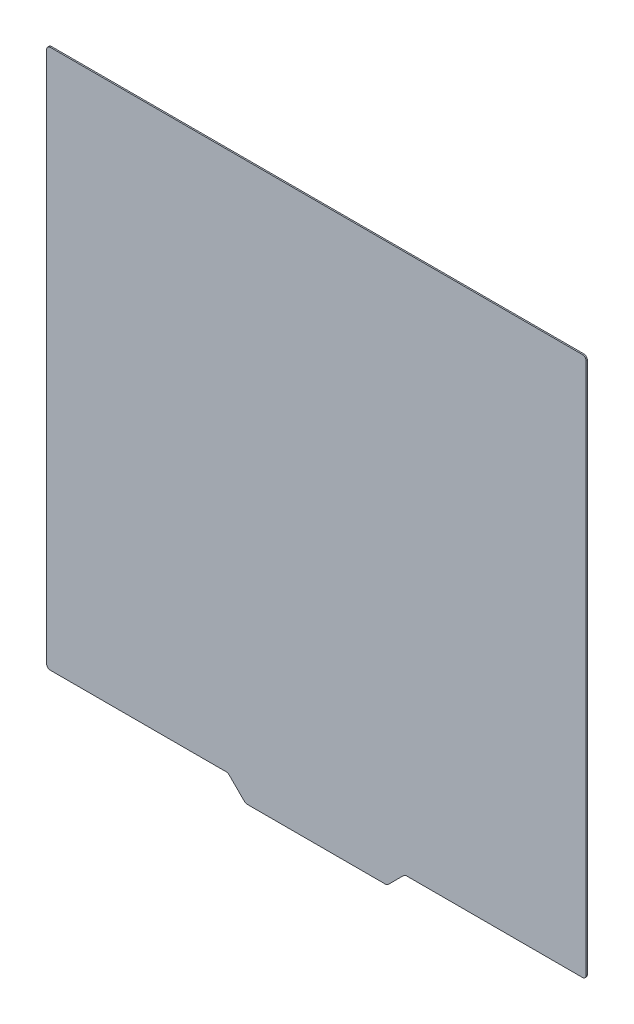
ISO-10303-21;
HEADER;
FILE_DESCRIPTION(('STEP AP214'),'2;1');
FILE_NAME('part.step','',(''),(''),'','','');
FILE_SCHEMA(('AUTOMOTIVE_DESIGN { 1 0 10303 214 1 1 1 1 }'));
ENDSEC;
DATA;
#1=APPLICATION_CONTEXT('core data for automotive mechanical design processes');
#2=APPLICATION_PROTOCOL_DEFINITION('international standard','automotive_design',2000,#1);
#3=PRODUCT_CONTEXT('',#1,'mechanical');
#4=PRODUCT('Part','Part','',(#3));
#5=PRODUCT_RELATED_PRODUCT_CATEGORY('part','',(#4));
#6=PRODUCT_DEFINITION_FORMATION('','',#4);
#7=PRODUCT_DEFINITION_CONTEXT('part definition',#1,'design');
#8=PRODUCT_DEFINITION('design','',#6,#7);
#9=PRODUCT_DEFINITION_SHAPE('','',#8);
#10=(LENGTH_UNIT() NAMED_UNIT(*) SI_UNIT(.MILLI.,.METRE.));
#11=(NAMED_UNIT(*) PLANE_ANGLE_UNIT() SI_UNIT($,.RADIAN.));
#12=(NAMED_UNIT(*) SI_UNIT($,.STERADIAN.) SOLID_ANGLE_UNIT());
#13=UNCERTAINTY_MEASURE_WITH_UNIT(LENGTH_MEASURE(1.E-05),#10,'distance_accuracy_value','');
#14=(GEOMETRIC_REPRESENTATION_CONTEXT(3) GLOBAL_UNCERTAINTY_ASSIGNED_CONTEXT((#13)) GLOBAL_UNIT_ASSIGNED_CONTEXT((#10,
#11,#12)) REPRESENTATION_CONTEXT('',''));
#15=CARTESIAN_POINT('',(0.,0.,0.));
#16=DIRECTION('',(0.,0.,1.));
#17=DIRECTION('',(1.,0.,0.));
#18=AXIS2_PLACEMENT_3D('',#15,#16,#17);
#19=CARTESIAN_POINT('',(152.5,-152.5,0.75));
#20=DIRECTION('',(-1.,0.,0.));
#21=DIRECTION('',(0.,0.,1.));
#22=AXIS2_PLACEMENT_3D('',#19,#20,#21);
#23=PLANE('',#22);
#24=DIRECTION('',(0.,1.,0.));
#25=VECTOR('',#24,1.);
#26=CARTESIAN_POINT('',(152.5,-152.5,0.75));
#27=LINE('',#26,#25);
#28=CARTESIAN_POINT('',(152.5,-150.5,0.75));
#29=VERTEX_POINT('',#28);
#30=CARTESIAN_POINT('',(152.5,150.5,0.75));
#31=VERTEX_POINT('',#30);
#32=EDGE_CURVE('E193',#29,#31,#27,.T.);
#33=ORIENTED_EDGE('',*,*,#32,.F.);
#34=DIRECTION('',(0.,0.,-1.));
#35=VECTOR('',#34,1.);
#36=CARTESIAN_POINT('',(152.5,-150.5,0.75));
#37=LINE('',#36,#35);
#38=CARTESIAN_POINT('',(152.5,-150.5,0.));
#39=VERTEX_POINT('',#38);
#40=EDGE_CURVE('E240',#29,#39,#37,.T.);
#41=ORIENTED_EDGE('',*,*,#40,.T.);
#42=DIRECTION('',(0.,1.,0.));
#43=VECTOR('',#42,1.);
#44=CARTESIAN_POINT('',(152.5,-152.5,0.));
#45=LINE('',#44,#43);
#46=CARTESIAN_POINT('',(152.5,150.5,0.));
#47=VERTEX_POINT('',#46);
#48=EDGE_CURVE('E268',#39,#47,#45,.T.);
#49=ORIENTED_EDGE('',*,*,#48,.T.);
#50=DIRECTION('',(0.,0.,-1.));
#51=VECTOR('',#50,1.);
#52=CARTESIAN_POINT('',(152.5,150.5,0.75));
#53=LINE('',#52,#51);
#54=EDGE_CURVE('E238',#47,#31,#53,.F.);
#55=ORIENTED_EDGE('',*,*,#54,.T.);
#56=EDGE_LOOP('',(#33,#41,#49,#55));
#57=FACE_BOUND('',#56,.T.);
#58=ADVANCED_FACE('F36',(#57),#23,.F.);
#59=CARTESIAN_POINT('',(-152.5,152.5,0.75));
#60=DIRECTION('',(0.,-1.,0.));
#61=DIRECTION('',(0.,0.,-1.));
#62=AXIS2_PLACEMENT_3D('',#59,#60,#61);
#63=PLANE('',#62);
#64=DIRECTION('',(-1.,0.,0.));
#65=VECTOR('',#64,1.);
#66=CARTESIAN_POINT('',(-152.5,152.5,0.));
#67=LINE('',#66,#65);
#68=CARTESIAN_POINT('',(150.5,152.5,0.));
#69=VERTEX_POINT('',#68);
#70=CARTESIAN_POINT('',(-150.5,152.5,0.));
#71=VERTEX_POINT('',#70);
#72=EDGE_CURVE('E182',#69,#71,#67,.T.);
#73=ORIENTED_EDGE('',*,*,#72,.T.);
#74=DIRECTION('',(0.,0.,-1.));
#75=VECTOR('',#74,1.);
#76=CARTESIAN_POINT('',(-150.5,152.5,0.75));
#77=LINE('',#76,#75);
#78=CARTESIAN_POINT('',(-150.5,152.5,0.75));
#79=VERTEX_POINT('',#78);
#80=EDGE_CURVE('E246',#71,#79,#77,.F.);
#81=ORIENTED_EDGE('',*,*,#80,.T.);
#82=DIRECTION('',(-1.,0.,0.));
#83=VECTOR('',#82,1.);
#84=CARTESIAN_POINT('',(-152.5,152.5,0.75));
#85=LINE('',#84,#83);
#86=CARTESIAN_POINT('',(150.5,152.5,0.75));
#87=VERTEX_POINT('',#86);
#88=EDGE_CURVE('E286',#87,#79,#85,.T.);
#89=ORIENTED_EDGE('',*,*,#88,.F.);
#90=DIRECTION('',(0.,0.,-1.));
#91=VECTOR('',#90,1.);
#92=CARTESIAN_POINT('',(150.5,152.5,0.75));
#93=LINE('',#92,#91);
#94=EDGE_CURVE('E243',#87,#69,#93,.T.);
#95=ORIENTED_EDGE('',*,*,#94,.T.);
#96=EDGE_LOOP('',(#73,#81,#89,#95));
#97=FACE_BOUND('',#96,.T.);
#98=ADVANCED_FACE('F274',(#97),#63,.F.);
#99=CARTESIAN_POINT('',(-152.5,-152.5,0.75));
#100=DIRECTION('',(1.,0.,0.));
#101=DIRECTION('',(0.,0.,-1.));
#102=AXIS2_PLACEMENT_3D('',#99,#100,#101);
#103=PLANE('',#102);
#104=DIRECTION('',(0.,-1.,0.));
#105=VECTOR('',#104,1.);
#106=CARTESIAN_POINT('',(-152.5,-152.5,0.));
#107=LINE('',#106,#105);
#108=CARTESIAN_POINT('',(-152.5,150.5,0.));
#109=VERTEX_POINT('',#108);
#110=CARTESIAN_POINT('',(-152.5,-150.5,0.));
#111=VERTEX_POINT('',#110);
#112=EDGE_CURVE('E177',#109,#111,#107,.T.);
#113=ORIENTED_EDGE('',*,*,#112,.T.);
#114=DIRECTION('',(0.,0.,-1.));
#115=VECTOR('',#114,1.);
#116=CARTESIAN_POINT('',(-152.5,-150.5,0.75));
#117=LINE('',#116,#115);
#118=CARTESIAN_POINT('',(-152.5,-150.5,0.75));
#119=VERTEX_POINT('',#118);
#120=EDGE_CURVE('E154',#111,#119,#117,.F.);
#121=ORIENTED_EDGE('',*,*,#120,.T.);
#122=DIRECTION('',(0.,-1.,0.));
#123=VECTOR('',#122,1.);
#124=CARTESIAN_POINT('',(-152.5,-152.5,0.75));
#125=LINE('',#124,#123);
#126=CARTESIAN_POINT('',(-152.5,150.5,0.75));
#127=VERTEX_POINT('',#126);
#128=EDGE_CURVE('E285',#127,#119,#125,.T.);
#129=ORIENTED_EDGE('',*,*,#128,.F.);
#130=DIRECTION('',(0.,0.,-1.));
#131=VECTOR('',#130,1.);
#132=CARTESIAN_POINT('',(-152.5,150.5,0.75));
#133=LINE('',#132,#131);
#134=EDGE_CURVE('E159',#127,#109,#133,.T.);
#135=ORIENTED_EDGE('',*,*,#134,.T.);
#136=EDGE_LOOP('',(#113,#121,#129,#135));
#137=FACE_BOUND('',#136,.T.);
#138=ADVANCED_FACE('F288',(#137),#103,.F.);
#139=CARTESIAN_POINT('',(-152.5,-152.5,0.75));
#140=DIRECTION('',(0.,1.,0.));
#141=DIRECTION('',(-1.,0.,0.));
#142=AXIS2_PLACEMENT_3D('',#139,#140,#141);
#143=PLANE('',#142);
#144=DIRECTION('',(1.,0.,0.));
#145=VECTOR('',#144,1.);
#146=CARTESIAN_POINT('',(-152.5,-152.5,0.75));
#147=LINE('',#146,#145);
#148=CARTESIAN_POINT('',(-150.5,-152.5,0.75));
#149=VERTEX_POINT('',#148);
#150=CARTESIAN_POINT('',(-50.8284271247462,-152.5,0.75));
#151=VERTEX_POINT('',#150);
#152=EDGE_CURVE('E169',#149,#151,#147,.T.);
#153=ORIENTED_EDGE('',*,*,#152,.F.);
#154=DIRECTION('',(0.,0.,-1.));
#155=VECTOR('',#154,1.);
#156=CARTESIAN_POINT('',(-150.5,-152.5,0.75));
#157=LINE('',#156,#155);
#158=CARTESIAN_POINT('',(-150.5,-152.5,0.));
#159=VERTEX_POINT('',#158);
#160=EDGE_CURVE('E153',#149,#159,#157,.T.);
#161=ORIENTED_EDGE('',*,*,#160,.T.);
#162=DIRECTION('',(1.,0.,0.));
#163=VECTOR('',#162,1.);
#164=CARTESIAN_POINT('',(-152.5,-152.5,0.));
#165=LINE('',#164,#163);
#166=CARTESIAN_POINT('',(-50.8284271247462,-152.5,0.));
#167=VERTEX_POINT('',#166);
#168=EDGE_CURVE('E166',#159,#167,#165,.T.);
#169=ORIENTED_EDGE('',*,*,#168,.T.);
#170=DIRECTION('',(0.,0.,-1.));
#171=VECTOR('',#170,1.);
#172=CARTESIAN_POINT('',(-50.8284271247462,-152.5,0.75));
#173=LINE('',#172,#171);
#174=EDGE_CURVE('E171',#167,#151,#173,.F.);
#175=ORIENTED_EDGE('',*,*,#174,.T.);
#176=EDGE_LOOP('',(#153,#161,#169,#175));
#177=FACE_BOUND('',#176,.T.);
#178=ADVANCED_FACE('F165',(#177),#143,.F.);
#179=CARTESIAN_POINT('',(-50.,-152.5,0.75));
#180=DIRECTION('',(0.707106781186549,0.707106781186547,0.));
#181=DIRECTION('',(-0.707106781186547,0.707106781186549,0.));
#182=AXIS2_PLACEMENT_3D('',#179,#180,#181);
#183=PLANE('',#182);
#184=DIRECTION('',(0.707106781186546,-0.707106781186548,0.));
#185=VECTOR('',#184,1.);
#186=CARTESIAN_POINT('',(-50.,-152.5,0.75));
#187=LINE('',#186,#185);
#188=CARTESIAN_POINT('',(-49.4142135623731,-153.085786437627,0.75));
#189=VERTEX_POINT('',#188);
#190=CARTESIAN_POINT('',(-40.585786437627,-161.914213562373,0.75));
#191=VERTEX_POINT('',#190);
#192=EDGE_CURVE('E290',#189,#191,#187,.T.);
#193=ORIENTED_EDGE('',*,*,#192,.F.);
#194=DIRECTION('',(0.,0.,-1.));
#195=VECTOR('',#194,1.);
#196=CARTESIAN_POINT('',(-49.4142135623731,-153.085786437627,0.));
#197=LINE('',#196,#195);
#198=CARTESIAN_POINT('',(-49.4142135623731,-153.085786437627,0.));
#199=VERTEX_POINT('',#198);
#200=EDGE_CURVE('E221',#189,#199,#197,.T.);
#201=ORIENTED_EDGE('',*,*,#200,.T.);
#202=DIRECTION('',(0.707106781186546,-0.707106781186548,0.));
#203=VECTOR('',#202,1.);
#204=CARTESIAN_POINT('',(-50.,-152.5,0.));
#205=LINE('',#204,#203);
#206=CARTESIAN_POINT('',(-40.585786437627,-161.914213562373,0.));
#207=VERTEX_POINT('',#206);
#208=EDGE_CURVE('E176',#199,#207,#205,.T.);
#209=ORIENTED_EDGE('',*,*,#208,.T.);
#210=DIRECTION('',(0.,0.,-1.));
#211=VECTOR('',#210,1.);
#212=CARTESIAN_POINT('',(-40.585786437627,-161.914213562373,0.75));
#213=LINE('',#212,#211);
#214=EDGE_CURVE('E219',#207,#191,#213,.F.);
#215=ORIENTED_EDGE('',*,*,#214,.T.);
#216=EDGE_LOOP('',(#193,#201,#209,#215));
#217=FACE_BOUND('',#216,.T.);
#218=ADVANCED_FACE('F312',(#217),#183,.F.);
#219=CARTESIAN_POINT('',(-40.,-162.5,0.75));
#220=DIRECTION('',(0.,1.,0.));
#221=DIRECTION('',(0.,0.,1.));
#222=AXIS2_PLACEMENT_3D('',#219,#220,#221);
#223=PLANE('',#222);
#224=DIRECTION('',(1.,0.,0.));
#225=VECTOR('',#224,1.);
#226=CARTESIAN_POINT('',(-40.,-162.5,0.75));
#227=LINE('',#226,#225);
#228=CARTESIAN_POINT('',(-39.1715728752539,-162.5,0.75));
#229=VERTEX_POINT('',#228);
#230=CARTESIAN_POINT('',(39.1715728752538,-162.5,0.75));
#231=VERTEX_POINT('',#230);
#232=EDGE_CURVE('E264',#229,#231,#227,.T.);
#233=ORIENTED_EDGE('',*,*,#232,.F.);
#234=DIRECTION('',(0.,0.,-1.));
#235=VECTOR('',#234,1.);
#236=CARTESIAN_POINT('',(-39.1715728752539,-162.5,0.75));
#237=LINE('',#236,#235);
#238=CARTESIAN_POINT('',(-39.1715728752539,-162.5,0.));
#239=VERTEX_POINT('',#238);
#240=EDGE_CURVE('E226',#229,#239,#237,.T.);
#241=ORIENTED_EDGE('',*,*,#240,.T.);
#242=DIRECTION('',(1.,0.,0.));
#243=VECTOR('',#242,1.);
#244=CARTESIAN_POINT('',(-40.,-162.5,0.));
#245=LINE('',#244,#243);
#246=CARTESIAN_POINT('',(39.1715728752538,-162.5,0.));
#247=VERTEX_POINT('',#246);
#248=EDGE_CURVE('E180',#239,#247,#245,.T.);
#249=ORIENTED_EDGE('',*,*,#248,.T.);
#250=DIRECTION('',(0.,0.,-1.));
#251=VECTOR('',#250,1.);
#252=CARTESIAN_POINT('',(39.1715728752538,-162.5,0.75));
#253=LINE('',#252,#251);
#254=EDGE_CURVE('E224',#247,#231,#253,.F.);
#255=ORIENTED_EDGE('',*,*,#254,.T.);
#256=EDGE_LOOP('',(#233,#241,#249,#255));
#257=FACE_BOUND('',#256,.T.);
#258=ADVANCED_FACE('F306',(#257),#223,.F.);
#259=CARTESIAN_POINT('',(40.,-162.5,0.75));
#260=DIRECTION('',(-0.707106781186547,0.707106781186548,0.));
#261=DIRECTION('',(-0.707106781186548,-0.707106781186547,0.));
#262=AXIS2_PLACEMENT_3D('',#259,#260,#261);
#263=PLANE('',#262);
#264=DIRECTION('',(0.707106781186548,0.707106781186547,0.));
#265=VECTOR('',#264,1.);
#266=CARTESIAN_POINT('',(40.,-162.5,0.75));
#267=LINE('',#266,#265);
#268=CARTESIAN_POINT('',(40.5857864376269,-161.914213562373,0.75));
#269=VERTEX_POINT('',#268);
#270=CARTESIAN_POINT('',(49.4142135623731,-153.085786437627,0.75));
#271=VERTEX_POINT('',#270);
#272=EDGE_CURVE('E262',#269,#271,#267,.T.);
#273=ORIENTED_EDGE('',*,*,#272,.F.);
#274=DIRECTION('',(0.,0.,-1.));
#275=VECTOR('',#274,1.);
#276=CARTESIAN_POINT('',(40.5857864376269,-161.914213562373,0.75));
#277=LINE('',#276,#275);
#278=CARTESIAN_POINT('',(40.5857864376269,-161.914213562373,0.));
#279=VERTEX_POINT('',#278);
#280=EDGE_CURVE('E231',#269,#279,#277,.T.);
#281=ORIENTED_EDGE('',*,*,#280,.T.);
#282=DIRECTION('',(0.707106781186548,0.707106781186547,0.));
#283=VECTOR('',#282,1.);
#284=CARTESIAN_POINT('',(40.,-162.5,0.));
#285=LINE('',#284,#283);
#286=CARTESIAN_POINT('',(49.4142135623731,-153.085786437627,0.));
#287=VERTEX_POINT('',#286);
#288=EDGE_CURVE('E188',#279,#287,#285,.T.);
#289=ORIENTED_EDGE('',*,*,#288,.T.);
#290=DIRECTION('',(0.,0.,-1.));
#291=VECTOR('',#290,1.);
#292=CARTESIAN_POINT('',(49.4142135623731,-153.085786437627,0.75));
#293=LINE('',#292,#291);
#294=EDGE_CURVE('E229',#287,#271,#293,.F.);
#295=ORIENTED_EDGE('',*,*,#294,.T.);
#296=EDGE_LOOP('',(#273,#281,#289,#295));
#297=FACE_BOUND('',#296,.T.);
#298=ADVANCED_FACE('F257',(#297),#263,.F.);
#299=CARTESIAN_POINT('',(50.,-152.5,0.75));
#300=DIRECTION('',(0.,1.,0.));
#301=DIRECTION('',(-1.,0.,0.));
#302=AXIS2_PLACEMENT_3D('',#299,#300,#301);
#303=PLANE('',#302);
#304=DIRECTION('',(1.,0.,0.));
#305=VECTOR('',#304,1.);
#306=CARTESIAN_POINT('',(50.,-152.5,0.75));
#307=LINE('',#306,#305);
#308=CARTESIAN_POINT('',(50.8284271247462,-152.5,0.75));
#309=VERTEX_POINT('',#308);
#310=CARTESIAN_POINT('',(150.5,-152.5,0.75));
#311=VERTEX_POINT('',#310);
#312=EDGE_CURVE('E194',#309,#311,#307,.T.);
#313=ORIENTED_EDGE('',*,*,#312,.F.);
#314=DIRECTION('',(0.,0.,-1.));
#315=VECTOR('',#314,1.);
#316=CARTESIAN_POINT('',(50.8284271247462,-152.5,0.));
#317=LINE('',#316,#315);
#318=CARTESIAN_POINT('',(50.8284271247462,-152.5,0.));
#319=VERTEX_POINT('',#318);
#320=EDGE_CURVE('E235',#309,#319,#317,.T.);
#321=ORIENTED_EDGE('',*,*,#320,.T.);
#322=DIRECTION('',(1.,0.,0.));
#323=VECTOR('',#322,1.);
#324=CARTESIAN_POINT('',(50.,-152.5,0.));
#325=LINE('',#324,#323);
#326=CARTESIAN_POINT('',(150.5,-152.5,0.));
#327=VERTEX_POINT('',#326);
#328=EDGE_CURVE('E191',#319,#327,#325,.T.);
#329=ORIENTED_EDGE('',*,*,#328,.T.);
#330=DIRECTION('',(0.,0.,-1.));
#331=VECTOR('',#330,1.);
#332=CARTESIAN_POINT('',(150.5,-152.5,0.75));
#333=LINE('',#332,#331);
#334=EDGE_CURVE('E51',#327,#311,#333,.F.);
#335=ORIENTED_EDGE('',*,*,#334,.T.);
#336=EDGE_LOOP('',(#313,#321,#329,#335));
#337=FACE_BOUND('',#336,.T.);
#338=ADVANCED_FACE('F260',(#337),#303,.F.);
#339=CARTESIAN_POINT('',(0.,0.,0.75));
#340=DIRECTION('',(0.,0.,-1.));
#341=DIRECTION('',(-1.,0.,0.));
#342=AXIS2_PLACEMENT_3D('',#339,#340,#341);
#343=PLANE('',#342);
#344=ORIENTED_EDGE('',*,*,#128,.T.);
#345=CARTESIAN_POINT('',(-150.5,-150.5,0.75));
#346=DIRECTION('',(0.,0.,-1.));
#347=DIRECTION('',(-1.,0.,0.));
#348=AXIS2_PLACEMENT_3D('',#345,#346,#347);
#349=CIRCLE('',#348,2.);
#350=EDGE_CURVE('E217',#119,#149,#349,.F.);
#351=ORIENTED_EDGE('',*,*,#350,.T.);
#352=ORIENTED_EDGE('',*,*,#152,.T.);
#353=CARTESIAN_POINT('',(-50.8284271247462,-154.5,0.75));
#354=DIRECTION('',(0.,0.,-1.));
#355=DIRECTION('',(-1.,0.,0.));
#356=AXIS2_PLACEMENT_3D('',#353,#354,#355);
#357=CIRCLE('',#356,2.);
#358=EDGE_CURVE('E249',#151,#189,#357,.T.);
#359=ORIENTED_EDGE('',*,*,#358,.T.);
#360=ORIENTED_EDGE('',*,*,#192,.T.);
#361=CARTESIAN_POINT('',(-39.1715728752539,-160.5,0.75));
#362=DIRECTION('',(0.,0.,-1.));
#363=DIRECTION('',(-1.,0.,0.));
#364=AXIS2_PLACEMENT_3D('',#361,#362,#363);
#365=CIRCLE('',#364,2.);
#366=EDGE_CURVE('E215',#191,#229,#365,.F.);
#367=ORIENTED_EDGE('',*,*,#366,.T.);
#368=ORIENTED_EDGE('',*,*,#232,.T.);
#369=CARTESIAN_POINT('',(39.1715728752538,-160.5,0.75));
#370=DIRECTION('',(0.,0.,-1.));
#371=DIRECTION('',(-1.,0.,0.));
#372=AXIS2_PLACEMENT_3D('',#369,#370,#371);
#373=CIRCLE('',#372,2.);
#374=EDGE_CURVE('E213',#231,#269,#373,.F.);
#375=ORIENTED_EDGE('',*,*,#374,.T.);
#376=ORIENTED_EDGE('',*,*,#272,.T.);
#377=CARTESIAN_POINT('',(50.8284271247462,-154.5,0.75));
#378=DIRECTION('',(0.,0.,-1.));
#379=DIRECTION('',(-1.,0.,0.));
#380=AXIS2_PLACEMENT_3D('',#377,#378,#379);
#381=CIRCLE('',#380,2.);
#382=EDGE_CURVE('E11',#271,#309,#381,.T.);
#383=ORIENTED_EDGE('',*,*,#382,.T.);
#384=ORIENTED_EDGE('',*,*,#312,.T.);
#385=CARTESIAN_POINT('',(150.5,-150.5,0.75));
#386=DIRECTION('',(0.,0.,-1.));
#387=DIRECTION('',(-1.,0.,0.));
#388=AXIS2_PLACEMENT_3D('',#385,#386,#387);
#389=CIRCLE('',#388,2.);
#390=EDGE_CURVE('E211',#311,#29,#389,.F.);
#391=ORIENTED_EDGE('',*,*,#390,.T.);
#392=ORIENTED_EDGE('',*,*,#32,.T.);
#393=CARTESIAN_POINT('',(150.5,150.5,0.75));
#394=DIRECTION('',(0.,0.,-1.));
#395=DIRECTION('',(-1.,0.,0.));
#396=AXIS2_PLACEMENT_3D('',#393,#394,#395);
#397=CIRCLE('',#396,2.);
#398=EDGE_CURVE('E207',#31,#87,#397,.F.);
#399=ORIENTED_EDGE('',*,*,#398,.T.);
#400=ORIENTED_EDGE('',*,*,#88,.T.);
#401=CARTESIAN_POINT('',(-150.5,150.5,0.75));
#402=DIRECTION('',(0.,0.,-1.));
#403=DIRECTION('',(-1.,0.,0.));
#404=AXIS2_PLACEMENT_3D('',#401,#402,#403);
#405=CIRCLE('',#404,2.);
#406=EDGE_CURVE('E209',#79,#127,#405,.F.);
#407=ORIENTED_EDGE('',*,*,#406,.T.);
#408=EDGE_LOOP('',(#344,#351,#352,#359,#360,#367,#368,#375,#376,#383,#384,#391,#392,#399,#400,#407));
#409=FACE_BOUND('',#408,.T.);
#410=ADVANCED_FACE('F284',(#409),#343,.F.);
#411=CARTESIAN_POINT('',(0.,0.,0.));
#412=DIRECTION('',(0.,0.,-1.));
#413=DIRECTION('',(-1.,0.,0.));
#414=AXIS2_PLACEMENT_3D('',#411,#412,#413);
#415=PLANE('',#414);
#416=ORIENTED_EDGE('',*,*,#168,.F.);
#417=CARTESIAN_POINT('',(-150.5,-150.5,0.));
#418=DIRECTION('',(0.,0.,-1.));
#419=DIRECTION('',(-1.,0.,0.));
#420=AXIS2_PLACEMENT_3D('',#417,#418,#419);
#421=CIRCLE('',#420,2.);
#422=EDGE_CURVE('E149',#159,#111,#421,.T.);
#423=ORIENTED_EDGE('',*,*,#422,.T.);
#424=ORIENTED_EDGE('',*,*,#112,.F.);
#425=CARTESIAN_POINT('',(-150.5,150.5,0.));
#426=DIRECTION('',(0.,0.,-1.));
#427=DIRECTION('',(-1.,0.,0.));
#428=AXIS2_PLACEMENT_3D('',#425,#426,#427);
#429=CIRCLE('',#428,2.);
#430=EDGE_CURVE('E197',#109,#71,#429,.T.);
#431=ORIENTED_EDGE('',*,*,#430,.T.);
#432=ORIENTED_EDGE('',*,*,#72,.F.);
#433=CARTESIAN_POINT('',(150.5,150.5,0.));
#434=DIRECTION('',(0.,0.,-1.));
#435=DIRECTION('',(-1.,0.,0.));
#436=AXIS2_PLACEMENT_3D('',#433,#434,#435);
#437=CIRCLE('',#436,2.);
#438=EDGE_CURVE('E170',#69,#47,#437,.T.);
#439=ORIENTED_EDGE('',*,*,#438,.T.);
#440=ORIENTED_EDGE('',*,*,#48,.F.);
#441=CARTESIAN_POINT('',(150.5,-150.5,0.));
#442=DIRECTION('',(0.,0.,-1.));
#443=DIRECTION('',(-1.,0.,0.));
#444=AXIS2_PLACEMENT_3D('',#441,#442,#443);
#445=CIRCLE('',#444,2.);
#446=EDGE_CURVE('E199',#39,#327,#445,.T.);
#447=ORIENTED_EDGE('',*,*,#446,.T.);
#448=ORIENTED_EDGE('',*,*,#328,.F.);
#449=CARTESIAN_POINT('',(50.8284271247462,-154.5,0.));
#450=DIRECTION('',(0.,0.,-1.));
#451=DIRECTION('',(-1.,0.,0.));
#452=AXIS2_PLACEMENT_3D('',#449,#450,#451);
#453=CIRCLE('',#452,2.);
#454=EDGE_CURVE('E44',#319,#287,#453,.F.);
#455=ORIENTED_EDGE('',*,*,#454,.T.);
#456=ORIENTED_EDGE('',*,*,#288,.F.);
#457=CARTESIAN_POINT('',(39.1715728752538,-160.5,0.));
#458=DIRECTION('',(0.,0.,-1.));
#459=DIRECTION('',(-1.,0.,0.));
#460=AXIS2_PLACEMENT_3D('',#457,#458,#459);
#461=CIRCLE('',#460,2.);
#462=EDGE_CURVE('E201',#279,#247,#461,.T.);
#463=ORIENTED_EDGE('',*,*,#462,.T.);
#464=ORIENTED_EDGE('',*,*,#248,.F.);
#465=CARTESIAN_POINT('',(-39.1715728752539,-160.5,0.));
#466=DIRECTION('',(0.,0.,-1.));
#467=DIRECTION('',(-1.,0.,0.));
#468=AXIS2_PLACEMENT_3D('',#465,#466,#467);
#469=CIRCLE('',#468,2.);
#470=EDGE_CURVE('E160',#239,#207,#469,.T.);
#471=ORIENTED_EDGE('',*,*,#470,.T.);
#472=ORIENTED_EDGE('',*,*,#208,.F.);
#473=CARTESIAN_POINT('',(-50.8284271247462,-154.5,0.));
#474=DIRECTION('',(0.,0.,-1.));
#475=DIRECTION('',(-1.,0.,0.));
#476=AXIS2_PLACEMENT_3D('',#473,#474,#475);
#477=CIRCLE('',#476,2.);
#478=EDGE_CURVE('E175',#199,#167,#477,.F.);
#479=ORIENTED_EDGE('',*,*,#478,.T.);
#480=EDGE_LOOP('',(#416,#423,#424,#431,#432,#439,#440,#447,#448,#455,#456,#463,#464,#471,#472,#479));
#481=FACE_BOUND('',#480,.T.);
#482=ADVANCED_FACE('F173',(#481),#415,.T.);
#483=CARTESIAN_POINT('',(-150.5,-150.5,0.75));
#484=DIRECTION('',(0.,0.,-1.));
#485=DIRECTION('',(-1.,0.,0.));
#486=AXIS2_PLACEMENT_3D('',#483,#484,#485);
#487=CYLINDRICAL_SURFACE('',#486,2.);
#488=ORIENTED_EDGE('',*,*,#350,.F.);
#489=ORIENTED_EDGE('',*,*,#120,.F.);
#490=ORIENTED_EDGE('',*,*,#422,.F.);
#491=ORIENTED_EDGE('',*,*,#160,.F.);
#492=EDGE_LOOP('',(#488,#489,#490,#491));
#493=FACE_BOUND('',#492,.T.);
#494=ADVANCED_FACE('F152',(#493),#487,.T.);
#495=CARTESIAN_POINT('',(-50.8284271247462,-154.5,0.75));
#496=DIRECTION('',(0.,0.,1.));
#497=DIRECTION('',(1.,0.,0.));
#498=AXIS2_PLACEMENT_3D('',#495,#496,#497);
#499=CYLINDRICAL_SURFACE('',#498,2.);
#500=ORIENTED_EDGE('',*,*,#358,.F.);
#501=ORIENTED_EDGE('',*,*,#174,.F.);
#502=ORIENTED_EDGE('',*,*,#478,.F.);
#503=ORIENTED_EDGE('',*,*,#200,.F.);
#504=EDGE_LOOP('',(#500,#501,#502,#503));
#505=FACE_BOUND('',#504,.T.);
#506=ADVANCED_FACE('F316',(#505),#499,.F.);
#507=CARTESIAN_POINT('',(-39.1715728752539,-160.5,0.75));
#508=DIRECTION('',(0.,0.,-1.));
#509=DIRECTION('',(-1.,0.,0.));
#510=AXIS2_PLACEMENT_3D('',#507,#508,#509);
#511=CYLINDRICAL_SURFACE('',#510,2.);
#512=ORIENTED_EDGE('',*,*,#366,.F.);
#513=ORIENTED_EDGE('',*,*,#214,.F.);
#514=ORIENTED_EDGE('',*,*,#470,.F.);
#515=ORIENTED_EDGE('',*,*,#240,.F.);
#516=EDGE_LOOP('',(#512,#513,#514,#515));
#517=FACE_BOUND('',#516,.T.);
#518=ADVANCED_FACE('F308',(#517),#511,.T.);
#519=CARTESIAN_POINT('',(39.1715728752538,-160.5,0.75));
#520=DIRECTION('',(0.,0.,-1.));
#521=DIRECTION('',(-1.,0.,0.));
#522=AXIS2_PLACEMENT_3D('',#519,#520,#521);
#523=CYLINDRICAL_SURFACE('',#522,2.);
#524=ORIENTED_EDGE('',*,*,#374,.F.);
#525=ORIENTED_EDGE('',*,*,#254,.F.);
#526=ORIENTED_EDGE('',*,*,#462,.F.);
#527=ORIENTED_EDGE('',*,*,#280,.F.);
#528=EDGE_LOOP('',(#524,#525,#526,#527));
#529=FACE_BOUND('',#528,.T.);
#530=ADVANCED_FACE('F304',(#529),#523,.T.);
#531=CARTESIAN_POINT('',(50.8284271247462,-154.5,0.75));
#532=DIRECTION('',(0.,0.,1.));
#533=DIRECTION('',(1.,0.,0.));
#534=AXIS2_PLACEMENT_3D('',#531,#532,#533);
#535=CYLINDRICAL_SURFACE('',#534,2.);
#536=ORIENTED_EDGE('',*,*,#382,.F.);
#537=ORIENTED_EDGE('',*,*,#294,.F.);
#538=ORIENTED_EDGE('',*,*,#454,.F.);
#539=ORIENTED_EDGE('',*,*,#320,.F.);
#540=EDGE_LOOP('',(#536,#537,#538,#539));
#541=FACE_BOUND('',#540,.T.);
#542=ADVANCED_FACE('F259',(#541),#535,.F.);
#543=CARTESIAN_POINT('',(150.5,-150.5,0.75));
#544=DIRECTION('',(0.,0.,-1.));
#545=DIRECTION('',(-1.,0.,0.));
#546=AXIS2_PLACEMENT_3D('',#543,#544,#545);
#547=CYLINDRICAL_SURFACE('',#546,2.);
#548=ORIENTED_EDGE('',*,*,#390,.F.);
#549=ORIENTED_EDGE('',*,*,#334,.F.);
#550=ORIENTED_EDGE('',*,*,#446,.F.);
#551=ORIENTED_EDGE('',*,*,#40,.F.);
#552=EDGE_LOOP('',(#548,#549,#550,#551));
#553=FACE_BOUND('',#552,.T.);
#554=ADVANCED_FACE('F388',(#553),#547,.T.);
#555=CARTESIAN_POINT('',(-150.5,150.5,0.75));
#556=DIRECTION('',(0.,0.,-1.));
#557=DIRECTION('',(-1.,0.,0.));
#558=AXIS2_PLACEMENT_3D('',#555,#556,#557);
#559=CYLINDRICAL_SURFACE('',#558,2.);
#560=ORIENTED_EDGE('',*,*,#406,.F.);
#561=ORIENTED_EDGE('',*,*,#80,.F.);
#562=ORIENTED_EDGE('',*,*,#430,.F.);
#563=ORIENTED_EDGE('',*,*,#134,.F.);
#564=EDGE_LOOP('',(#560,#561,#562,#563));
#565=FACE_BOUND('',#564,.T.);
#566=ADVANCED_FACE('F280',(#565),#559,.T.);
#567=CARTESIAN_POINT('',(150.5,150.5,0.75));
#568=DIRECTION('',(0.,0.,-1.));
#569=DIRECTION('',(-1.,0.,0.));
#570=AXIS2_PLACEMENT_3D('',#567,#568,#569);
#571=CYLINDRICAL_SURFACE('',#570,2.);
#572=ORIENTED_EDGE('',*,*,#398,.F.);
#573=ORIENTED_EDGE('',*,*,#54,.F.);
#574=ORIENTED_EDGE('',*,*,#438,.F.);
#575=ORIENTED_EDGE('',*,*,#94,.F.);
#576=EDGE_LOOP('',(#572,#573,#574,#575));
#577=FACE_BOUND('',#576,.T.);
#578=ADVANCED_FACE('F38',(#577),#571,.T.);
#579=CLOSED_SHELL('',(#58,#98,#138,#178,#218,#258,#298,#338,#410,#482,#494,#506,#518,#530,#542,
#554,#566,#578));
#580=MANIFOLD_SOLID_BREP('B2',#579);
#581=ADVANCED_BREP_SHAPE_REPRESENTATION('',(#18,#580),#14);
#582=SHAPE_DEFINITION_REPRESENTATION(#9,#581);
ENDSEC;
END-ISO-10303-21;
